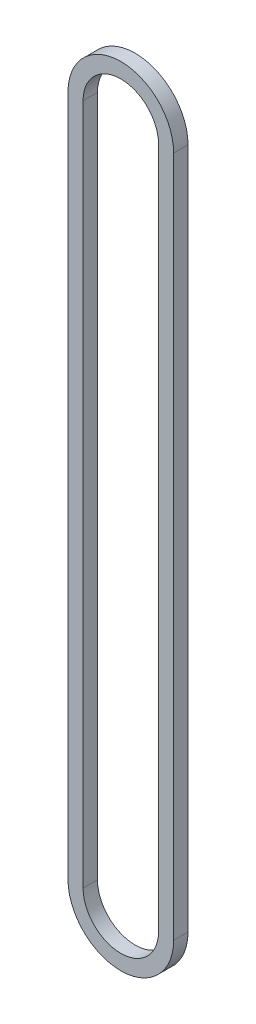
ISO-10303-21;
HEADER;
FILE_DESCRIPTION(('STEP AP214'),'2;1');
FILE_NAME('part.step','',(''),(''),'','','');
FILE_SCHEMA(('AUTOMOTIVE_DESIGN { 1 0 10303 214 1 1 1 1 }'));
ENDSEC;
DATA;
#1=APPLICATION_CONTEXT('core data for automotive mechanical design processes');
#2=APPLICATION_PROTOCOL_DEFINITION('international standard','automotive_design',2000,#1);
#3=PRODUCT_CONTEXT('',#1,'mechanical');
#4=PRODUCT('Part','Part','',(#3));
#5=PRODUCT_RELATED_PRODUCT_CATEGORY('part','',(#4));
#6=PRODUCT_DEFINITION_FORMATION('','',#4);
#7=PRODUCT_DEFINITION_CONTEXT('part definition',#1,'design');
#8=PRODUCT_DEFINITION('design','',#6,#7);
#9=PRODUCT_DEFINITION_SHAPE('','',#8);
#10=(LENGTH_UNIT() NAMED_UNIT(*) SI_UNIT(.MILLI.,.METRE.));
#11=(NAMED_UNIT(*) PLANE_ANGLE_UNIT() SI_UNIT($,.RADIAN.));
#12=(NAMED_UNIT(*) SI_UNIT($,.STERADIAN.) SOLID_ANGLE_UNIT());
#13=UNCERTAINTY_MEASURE_WITH_UNIT(LENGTH_MEASURE(1.E-05),#10,'distance_accuracy_value','');
#14=(GEOMETRIC_REPRESENTATION_CONTEXT(3) GLOBAL_UNCERTAINTY_ASSIGNED_CONTEXT((#13)) GLOBAL_UNIT_ASSIGNED_CONTEXT((#10,
#11,#12)) REPRESENTATION_CONTEXT('',''));
#15=CARTESIAN_POINT('',(0.,0.,0.));
#16=DIRECTION('',(0.,0.,1.));
#17=DIRECTION('',(1.,0.,0.));
#18=AXIS2_PLACEMENT_3D('',#15,#16,#17);
#19=CARTESIAN_POINT('',(-1.14383763256872E-13,90.3354475455742,3.81));
#20=DIRECTION('',(0.,0.,1.));
#21=DIRECTION('',(1.,0.,0.));
#22=AXIS2_PLACEMENT_3D('',#19,#20,#21);
#23=PLANE('',#22);
#24=CARTESIAN_POINT('',(-1.14383763256872E-13,90.3354475455742,3.81));
#25=DIRECTION('',(0.,0.,1.));
#26=DIRECTION('',(1.,0.,0.));
#27=AXIS2_PLACEMENT_3D('',#24,#25,#26);
#28=CIRCLE('',#27,14.);
#29=CARTESIAN_POINT('',(13.9999999999999,90.3354475455742,3.81));
#30=VERTEX_POINT('',#29);
#31=CARTESIAN_POINT('',(-14.0000000000001,90.3354475455742,3.81));
#32=VERTEX_POINT('',#31);
#33=EDGE_CURVE('E157',#30,#32,#28,.T.);
#34=ORIENTED_EDGE('',*,*,#33,.T.);
#35=DIRECTION('',(0.,-1.,0.));
#36=VECTOR('',#35,1.);
#37=CARTESIAN_POINT('',(-14.0000000000001,90.3354475455742,3.81));
#38=LINE('',#37,#36);
#39=CARTESIAN_POINT('',(-14.0000000000001,-90.3354475455742,3.81));
#40=VERTEX_POINT('',#39);
#41=EDGE_CURVE('E162',#32,#40,#38,.T.);
#42=ORIENTED_EDGE('',*,*,#41,.T.);
#43=CARTESIAN_POINT('',(0.,-90.3354475455742,3.81));
#44=DIRECTION('',(0.,0.,1.));
#45=DIRECTION('',(1.,0.,0.));
#46=AXIS2_PLACEMENT_3D('',#43,#44,#45);
#47=CIRCLE('',#46,14.);
#48=CARTESIAN_POINT('',(13.9999999999999,-90.3354475455742,3.81));
#49=VERTEX_POINT('',#48);
#50=EDGE_CURVE('E170',#40,#49,#47,.T.);
#51=ORIENTED_EDGE('',*,*,#50,.T.);
#52=DIRECTION('',(0.,1.,0.));
#53=VECTOR('',#52,1.);
#54=CARTESIAN_POINT('',(13.9999999999999,90.3354475455742,3.81));
#55=LINE('',#54,#53);
#56=EDGE_CURVE('E168',#49,#30,#55,.T.);
#57=ORIENTED_EDGE('',*,*,#56,.T.);
#58=EDGE_LOOP('',(#34,#42,#51,#57));
#59=FACE_BOUND('',#58,.T.);
#60=DIRECTION('',(0.,1.,0.));
#61=VECTOR('',#60,1.);
#62=CARTESIAN_POINT('',(9.99999999999997,-90.3354475455742,3.81));
#63=LINE('',#62,#61);
#64=CARTESIAN_POINT('',(9.99999999999997,-90.3354475455742,3.81));
#65=VERTEX_POINT('',#64);
#66=CARTESIAN_POINT('',(9.99999999999989,90.3354475455742,3.81));
#67=VERTEX_POINT('',#66);
#68=EDGE_CURVE('E117',#65,#67,#63,.T.);
#69=ORIENTED_EDGE('',*,*,#68,.F.);
#70=CARTESIAN_POINT('',(0.,-90.3354475455742,3.81));
#71=DIRECTION('',(0.,0.,1.));
#72=DIRECTION('',(1.,0.,0.));
#73=AXIS2_PLACEMENT_3D('',#70,#71,#72);
#74=CIRCLE('',#73,10.);
#75=CARTESIAN_POINT('',(-10.,-90.3354475455742,3.81));
#76=VERTEX_POINT('',#75);
#77=EDGE_CURVE('E112',#76,#65,#74,.T.);
#78=ORIENTED_EDGE('',*,*,#77,.F.);
#79=DIRECTION('',(0.,-1.,0.));
#80=VECTOR('',#79,1.);
#81=CARTESIAN_POINT('',(-10.,-90.3354475455742,3.81));
#82=LINE('',#81,#80);
#83=CARTESIAN_POINT('',(-10.0000000000001,90.3354475455742,3.81));
#84=VERTEX_POINT('',#83);
#85=EDGE_CURVE('E140',#84,#76,#82,.T.);
#86=ORIENTED_EDGE('',*,*,#85,.F.);
#87=CARTESIAN_POINT('',(-1.14383763256872E-13,90.3354475455742,3.81));
#88=DIRECTION('',(0.,0.,1.));
#89=DIRECTION('',(1.,0.,0.));
#90=AXIS2_PLACEMENT_3D('',#87,#88,#89);
#91=CIRCLE('',#90,10.);
#92=EDGE_CURVE('E135',#67,#84,#91,.T.);
#93=ORIENTED_EDGE('',*,*,#92,.F.);
#94=EDGE_LOOP('',(#69,#78,#86,#93));
#95=FACE_BOUND('',#94,.T.);
#96=ADVANCED_FACE('F44',(#59,#95),#23,.T.);
#97=CARTESIAN_POINT('',(-1.14383763256872E-13,90.3354475455742,0.));
#98=DIRECTION('',(0.,0.,1.));
#99=DIRECTION('',(1.,0.,0.));
#100=AXIS2_PLACEMENT_3D('',#97,#98,#99);
#101=PLANE('',#100);
#102=CARTESIAN_POINT('',(-1.14383763256872E-13,90.3354475455742,0.));
#103=DIRECTION('',(0.,0.,1.));
#104=DIRECTION('',(1.,0.,0.));
#105=AXIS2_PLACEMENT_3D('',#102,#103,#104);
#106=CIRCLE('',#105,14.);
#107=CARTESIAN_POINT('',(13.9999999999999,90.3354475455742,0.));
#108=VERTEX_POINT('',#107);
#109=CARTESIAN_POINT('',(-14.0000000000001,90.3354475455742,0.));
#110=VERTEX_POINT('',#109);
#111=EDGE_CURVE('E129',#108,#110,#106,.T.);
#112=ORIENTED_EDGE('',*,*,#111,.F.);
#113=DIRECTION('',(0.,1.,0.));
#114=VECTOR('',#113,1.);
#115=CARTESIAN_POINT('',(13.9999999999999,90.3354475455742,0.));
#116=LINE('',#115,#114);
#117=CARTESIAN_POINT('',(13.9999999999999,-90.3354475455742,0.));
#118=VERTEX_POINT('',#117);
#119=EDGE_CURVE('E163',#118,#108,#116,.T.);
#120=ORIENTED_EDGE('',*,*,#119,.F.);
#121=CARTESIAN_POINT('',(0.,-90.3354475455742,0.));
#122=DIRECTION('',(0.,0.,1.));
#123=DIRECTION('',(1.,0.,0.));
#124=AXIS2_PLACEMENT_3D('',#121,#122,#123);
#125=CIRCLE('',#124,14.);
#126=CARTESIAN_POINT('',(-14.0000000000001,-90.3354475455742,0.));
#127=VERTEX_POINT('',#126);
#128=EDGE_CURVE('E178',#127,#118,#125,.T.);
#129=ORIENTED_EDGE('',*,*,#128,.F.);
#130=DIRECTION('',(0.,-1.,0.));
#131=VECTOR('',#130,1.);
#132=CARTESIAN_POINT('',(-14.0000000000001,90.3354475455742,0.));
#133=LINE('',#132,#131);
#134=EDGE_CURVE('E180',#110,#127,#133,.T.);
#135=ORIENTED_EDGE('',*,*,#134,.F.);
#136=EDGE_LOOP('',(#112,#120,#129,#135));
#137=FACE_BOUND('',#136,.T.);
#138=CARTESIAN_POINT('',(0.,-90.3354475455742,0.));
#139=DIRECTION('',(0.,0.,1.));
#140=DIRECTION('',(1.,0.,0.));
#141=AXIS2_PLACEMENT_3D('',#138,#139,#140);
#142=CIRCLE('',#141,10.);
#143=CARTESIAN_POINT('',(-10.,-90.3354475455742,0.));
#144=VERTEX_POINT('',#143);
#145=CARTESIAN_POINT('',(9.99999999999997,-90.3354475455742,0.));
#146=VERTEX_POINT('',#145);
#147=EDGE_CURVE('E66',#144,#146,#142,.T.);
#148=ORIENTED_EDGE('',*,*,#147,.T.);
#149=DIRECTION('',(0.,1.,0.));
#150=VECTOR('',#149,1.);
#151=CARTESIAN_POINT('',(9.99999999999997,-90.3354475455742,0.));
#152=LINE('',#151,#150);
#153=CARTESIAN_POINT('',(9.99999999999989,90.3354475455742,0.));
#154=VERTEX_POINT('',#153);
#155=EDGE_CURVE('E130',#146,#154,#152,.T.);
#156=ORIENTED_EDGE('',*,*,#155,.T.);
#157=CARTESIAN_POINT('',(-1.14383763256872E-13,90.3354475455742,0.));
#158=DIRECTION('',(0.,0.,1.));
#159=DIRECTION('',(1.,0.,0.));
#160=AXIS2_PLACEMENT_3D('',#157,#158,#159);
#161=CIRCLE('',#160,10.);
#162=CARTESIAN_POINT('',(-10.0000000000001,90.3354475455742,0.));
#163=VERTEX_POINT('',#162);
#164=EDGE_CURVE('E148',#154,#163,#161,.T.);
#165=ORIENTED_EDGE('',*,*,#164,.T.);
#166=DIRECTION('',(0.,-1.,0.));
#167=VECTOR('',#166,1.);
#168=CARTESIAN_POINT('',(-10.,-90.3354475455742,0.));
#169=LINE('',#168,#167);
#170=EDGE_CURVE('E122',#163,#144,#169,.T.);
#171=ORIENTED_EDGE('',*,*,#170,.T.);
#172=EDGE_LOOP('',(#148,#156,#165,#171));
#173=FACE_BOUND('',#172,.T.);
#174=ADVANCED_FACE('F201',(#137,#173),#101,.F.);
#175=CARTESIAN_POINT('',(-1.14383763256872E-13,90.3354475455742,3.81));
#176=DIRECTION('',(0.,0.,-1.));
#177=DIRECTION('',(-1.,0.,0.));
#178=AXIS2_PLACEMENT_3D('',#175,#176,#177);
#179=CYLINDRICAL_SURFACE('',#178,14.);
#180=ORIENTED_EDGE('',*,*,#111,.T.);
#181=DIRECTION('',(0.,0.,-1.));
#182=VECTOR('',#181,1.);
#183=CARTESIAN_POINT('',(-14.0000000000001,90.3354475455742,3.81));
#184=LINE('',#183,#182);
#185=EDGE_CURVE('E11',#32,#110,#184,.T.);
#186=ORIENTED_EDGE('',*,*,#185,.F.);
#187=ORIENTED_EDGE('',*,*,#33,.F.);
#188=DIRECTION('',(0.,0.,-1.));
#189=VECTOR('',#188,1.);
#190=CARTESIAN_POINT('',(13.9999999999999,90.3354475455742,3.81));
#191=LINE('',#190,#189);
#192=EDGE_CURVE('E175',#30,#108,#191,.T.);
#193=ORIENTED_EDGE('',*,*,#192,.T.);
#194=EDGE_LOOP('',(#180,#186,#187,#193));
#195=FACE_BOUND('',#194,.T.);
#196=ADVANCED_FACE('F50',(#195),#179,.T.);
#197=CARTESIAN_POINT('',(-14.0000000000001,90.3354475455742,3.81));
#198=DIRECTION('',(1.,0.,0.));
#199=DIRECTION('',(0.,1.,0.));
#200=AXIS2_PLACEMENT_3D('',#197,#198,#199);
#201=PLANE('',#200);
#202=ORIENTED_EDGE('',*,*,#134,.T.);
#203=DIRECTION('',(0.,0.,-1.));
#204=VECTOR('',#203,1.);
#205=CARTESIAN_POINT('',(-14.0000000000001,-90.3354475455742,3.81));
#206=LINE('',#205,#204);
#207=EDGE_CURVE('E53',#40,#127,#206,.T.);
#208=ORIENTED_EDGE('',*,*,#207,.F.);
#209=ORIENTED_EDGE('',*,*,#41,.F.);
#210=ORIENTED_EDGE('',*,*,#185,.T.);
#211=EDGE_LOOP('',(#202,#208,#209,#210));
#212=FACE_BOUND('',#211,.T.);
#213=ADVANCED_FACE('F213',(#212),#201,.F.);
#214=CARTESIAN_POINT('',(0.,-90.3354475455742,3.81));
#215=DIRECTION('',(0.,0.,-1.));
#216=DIRECTION('',(-1.,0.,0.));
#217=AXIS2_PLACEMENT_3D('',#214,#215,#216);
#218=CYLINDRICAL_SURFACE('',#217,14.);
#219=ORIENTED_EDGE('',*,*,#128,.T.);
#220=DIRECTION('',(0.,0.,-1.));
#221=VECTOR('',#220,1.);
#222=CARTESIAN_POINT('',(13.9999999999999,-90.3354475455742,3.81));
#223=LINE('',#222,#221);
#224=EDGE_CURVE('E190',#49,#118,#223,.T.);
#225=ORIENTED_EDGE('',*,*,#224,.F.);
#226=ORIENTED_EDGE('',*,*,#50,.F.);
#227=ORIENTED_EDGE('',*,*,#207,.T.);
#228=EDGE_LOOP('',(#219,#225,#226,#227));
#229=FACE_BOUND('',#228,.T.);
#230=ADVANCED_FACE('F197',(#229),#218,.T.);
#231=CARTESIAN_POINT('',(13.9999999999999,90.3354475455742,3.81));
#232=DIRECTION('',(-1.,0.,0.));
#233=DIRECTION('',(0.,-1.,0.));
#234=AXIS2_PLACEMENT_3D('',#231,#232,#233);
#235=PLANE('',#234);
#236=ORIENTED_EDGE('',*,*,#119,.T.);
#237=ORIENTED_EDGE('',*,*,#192,.F.);
#238=ORIENTED_EDGE('',*,*,#56,.F.);
#239=ORIENTED_EDGE('',*,*,#224,.T.);
#240=EDGE_LOOP('',(#236,#237,#238,#239));
#241=FACE_BOUND('',#240,.T.);
#242=ADVANCED_FACE('F210',(#241),#235,.F.);
#243=CARTESIAN_POINT('',(0.,-90.3354475455742,3.81));
#244=DIRECTION('',(0.,0.,-1.));
#245=DIRECTION('',(-1.,0.,0.));
#246=AXIS2_PLACEMENT_3D('',#243,#244,#245);
#247=CYLINDRICAL_SURFACE('',#246,10.);
#248=ORIENTED_EDGE('',*,*,#147,.F.);
#249=DIRECTION('',(0.,0.,-1.));
#250=VECTOR('',#249,1.);
#251=CARTESIAN_POINT('',(-10.,-90.3354475455742,3.81));
#252=LINE('',#251,#250);
#253=EDGE_CURVE('E113',#76,#144,#252,.T.);
#254=ORIENTED_EDGE('',*,*,#253,.F.);
#255=ORIENTED_EDGE('',*,*,#77,.T.);
#256=DIRECTION('',(0.,0.,-1.));
#257=VECTOR('',#256,1.);
#258=CARTESIAN_POINT('',(9.99999999999997,-90.3354475455742,3.81));
#259=LINE('',#258,#257);
#260=EDGE_CURVE('E111',#65,#146,#259,.T.);
#261=ORIENTED_EDGE('',*,*,#260,.T.);
#262=EDGE_LOOP('',(#248,#254,#255,#261));
#263=FACE_BOUND('',#262,.T.);
#264=ADVANCED_FACE('F114',(#263),#247,.F.);
#265=CARTESIAN_POINT('',(9.99999999999997,-90.3354475455742,3.81));
#266=DIRECTION('',(-1.,0.,0.));
#267=DIRECTION('',(0.,-1.,0.));
#268=AXIS2_PLACEMENT_3D('',#265,#266,#267);
#269=PLANE('',#268);
#270=ORIENTED_EDGE('',*,*,#155,.F.);
#271=ORIENTED_EDGE('',*,*,#260,.F.);
#272=ORIENTED_EDGE('',*,*,#68,.T.);
#273=DIRECTION('',(0.,0.,-1.));
#274=VECTOR('',#273,1.);
#275=CARTESIAN_POINT('',(9.99999999999989,90.3354475455742,3.81));
#276=LINE('',#275,#274);
#277=EDGE_CURVE('E128',#67,#154,#276,.T.);
#278=ORIENTED_EDGE('',*,*,#277,.T.);
#279=EDGE_LOOP('',(#270,#271,#272,#278));
#280=FACE_BOUND('',#279,.T.);
#281=ADVANCED_FACE('F121',(#280),#269,.T.);
#282=CARTESIAN_POINT('',(-1.14383763256872E-13,90.3354475455742,3.81));
#283=DIRECTION('',(0.,0.,-1.));
#284=DIRECTION('',(-1.,0.,0.));
#285=AXIS2_PLACEMENT_3D('',#282,#283,#284);
#286=CYLINDRICAL_SURFACE('',#285,10.);
#287=ORIENTED_EDGE('',*,*,#164,.F.);
#288=ORIENTED_EDGE('',*,*,#277,.F.);
#289=ORIENTED_EDGE('',*,*,#92,.T.);
#290=DIRECTION('',(0.,0.,-1.));
#291=VECTOR('',#290,1.);
#292=CARTESIAN_POINT('',(-10.0000000000001,90.3354475455742,3.81));
#293=LINE('',#292,#291);
#294=EDGE_CURVE('E64',#84,#163,#293,.T.);
#295=ORIENTED_EDGE('',*,*,#294,.T.);
#296=EDGE_LOOP('',(#287,#288,#289,#295));
#297=FACE_BOUND('',#296,.T.);
#298=ADVANCED_FACE('F237',(#297),#286,.F.);
#299=CARTESIAN_POINT('',(-10.,-90.3354475455742,3.81));
#300=DIRECTION('',(1.,0.,0.));
#301=DIRECTION('',(0.,1.,0.));
#302=AXIS2_PLACEMENT_3D('',#299,#300,#301);
#303=PLANE('',#302);
#304=ORIENTED_EDGE('',*,*,#170,.F.);
#305=ORIENTED_EDGE('',*,*,#294,.F.);
#306=ORIENTED_EDGE('',*,*,#85,.T.);
#307=ORIENTED_EDGE('',*,*,#253,.T.);
#308=EDGE_LOOP('',(#304,#305,#306,#307));
#309=FACE_BOUND('',#308,.T.);
#310=ADVANCED_FACE('F238',(#309),#303,.T.);
#311=CLOSED_SHELL('',(#96,#174,#196,#213,#230,#242,#264,#281,#298,#310));
#312=MANIFOLD_SOLID_BREP('B2',#311);
#313=ADVANCED_BREP_SHAPE_REPRESENTATION('',(#18,#312),#14);
#314=SHAPE_DEFINITION_REPRESENTATION(#9,#313);
ENDSEC;
END-ISO-10303-21;
